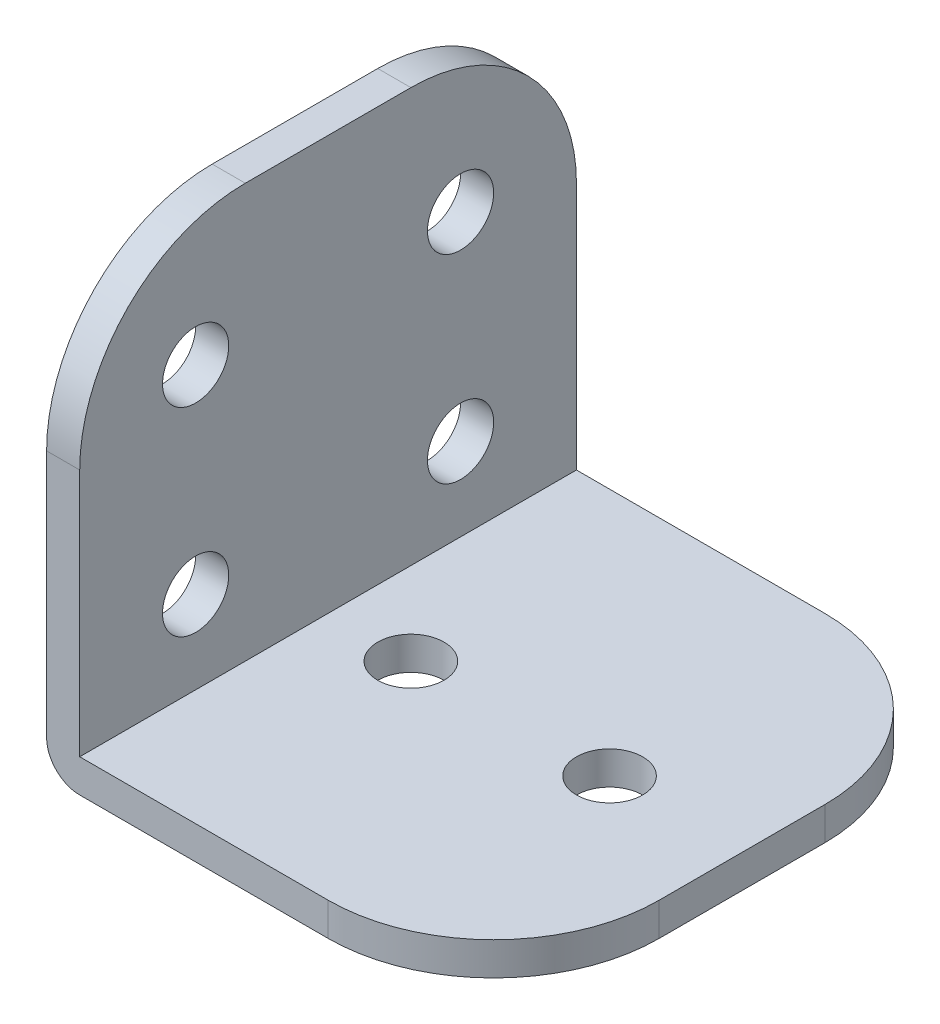
ISO-10303-21;
HEADER;
FILE_DESCRIPTION(('STEP AP214'),'2;1');
FILE_NAME('part.step','',(''),(''),'','','');
FILE_SCHEMA(('AUTOMOTIVE_DESIGN { 1 0 10303 214 1 1 1 1 }'));
ENDSEC;
DATA;
#1=APPLICATION_CONTEXT('core data for automotive mechanical design processes');
#2=APPLICATION_PROTOCOL_DEFINITION('international standard','automotive_design',2000,#1);
#3=PRODUCT_CONTEXT('',#1,'mechanical');
#4=PRODUCT('Part','Part','',(#3));
#5=PRODUCT_RELATED_PRODUCT_CATEGORY('part','',(#4));
#6=PRODUCT_DEFINITION_FORMATION('','',#4);
#7=PRODUCT_DEFINITION_CONTEXT('part definition',#1,'design');
#8=PRODUCT_DEFINITION('design','',#6,#7);
#9=PRODUCT_DEFINITION_SHAPE('','',#8);
#10=(LENGTH_UNIT() NAMED_UNIT(*) SI_UNIT(.MILLI.,.METRE.));
#11=(NAMED_UNIT(*) PLANE_ANGLE_UNIT() SI_UNIT($,.RADIAN.));
#12=(NAMED_UNIT(*) SI_UNIT($,.STERADIAN.) SOLID_ANGLE_UNIT());
#13=UNCERTAINTY_MEASURE_WITH_UNIT(LENGTH_MEASURE(1.E-05),#10,'distance_accuracy_value','');
#14=(GEOMETRIC_REPRESENTATION_CONTEXT(3) GLOBAL_UNCERTAINTY_ASSIGNED_CONTEXT((#13)) GLOBAL_UNIT_ASSIGNED_CONTEXT((#10,
#11,#12)) REPRESENTATION_CONTEXT('',''));
#15=CARTESIAN_POINT('',(0.,0.,0.));
#16=DIRECTION('',(0.,0.,1.));
#17=DIRECTION('',(1.,0.,0.));
#18=AXIS2_PLACEMENT_3D('',#15,#16,#17);
#19=CARTESIAN_POINT('',(0.,27.,15.));
#20=DIRECTION('',(0.,-1.,0.));
#21=DIRECTION('',(0.,0.,-1.));
#22=AXIS2_PLACEMENT_3D('',#19,#20,#21);
#23=PLANE('',#22);
#24=DIRECTION('',(0.,0.,-1.));
#25=VECTOR('',#24,1.);
#26=CARTESIAN_POINT('',(2.,27.,15.));
#27=LINE('',#26,#25);
#28=CARTESIAN_POINT('',(2.,27.,5.));
#29=VERTEX_POINT('',#28);
#30=CARTESIAN_POINT('',(2.,27.,-5.));
#31=VERTEX_POINT('',#30);
#32=EDGE_CURVE('E153',#29,#31,#27,.T.);
#33=ORIENTED_EDGE('',*,*,#32,.T.);
#34=DIRECTION('',(-1.,0.,0.));
#35=VECTOR('',#34,1.);
#36=CARTESIAN_POINT('',(0.,27.,-5.));
#37=LINE('',#36,#35);
#38=CARTESIAN_POINT('',(0.,27.,-5.));
#39=VERTEX_POINT('',#38);
#40=EDGE_CURVE('E198',#31,#39,#37,.T.);
#41=ORIENTED_EDGE('',*,*,#40,.T.);
#42=DIRECTION('',(0.,0.,-1.));
#43=VECTOR('',#42,1.);
#44=CARTESIAN_POINT('',(0.,27.,15.));
#45=LINE('',#44,#43);
#46=CARTESIAN_POINT('',(0.,27.,5.));
#47=VERTEX_POINT('',#46);
#48=EDGE_CURVE('E138',#47,#39,#45,.T.);
#49=ORIENTED_EDGE('',*,*,#48,.F.);
#50=DIRECTION('',(-1.,0.,0.));
#51=VECTOR('',#50,1.);
#52=CARTESIAN_POINT('',(2.,27.,5.));
#53=LINE('',#52,#51);
#54=EDGE_CURVE('E54',#47,#29,#53,.F.);
#55=ORIENTED_EDGE('',*,*,#54,.T.);
#56=EDGE_LOOP('',(#33,#41,#49,#55));
#57=FACE_BOUND('',#56,.T.);
#58=ADVANCED_FACE('F34',(#57),#23,.F.);
#59=CARTESIAN_POINT('',(0.,2.,15.));
#60=DIRECTION('',(1.,0.,0.));
#61=DIRECTION('',(0.,0.,-1.));
#62=AXIS2_PLACEMENT_3D('',#59,#60,#61);
#63=PLANE('',#62);
#64=CARTESIAN_POINT('',(0.,7.,8.));
#65=DIRECTION('',(1.,0.,0.));
#66=DIRECTION('',(0.,0.,-1.));
#67=AXIS2_PLACEMENT_3D('',#64,#65,#66);
#68=CIRCLE('',#67,2.);
#69=CARTESIAN_POINT('',(0.,7.,6.));
#70=VERTEX_POINT('',#69);
#71=EDGE_CURVE('E305',#70,#70,#68,.T.);
#72=ORIENTED_EDGE('',*,*,#71,.T.);
#73=EDGE_LOOP('',(#72));
#74=FACE_BOUND('',#73,.T.);
#75=CARTESIAN_POINT('',(0.,7.,-8.));
#76=DIRECTION('',(1.,0.,0.));
#77=DIRECTION('',(0.,0.,-1.));
#78=AXIS2_PLACEMENT_3D('',#75,#76,#77);
#79=CIRCLE('',#78,2.);
#80=CARTESIAN_POINT('',(0.,7.,-10.));
#81=VERTEX_POINT('',#80);
#82=EDGE_CURVE('E301',#81,#81,#79,.T.);
#83=ORIENTED_EDGE('',*,*,#82,.T.);
#84=EDGE_LOOP('',(#83));
#85=FACE_BOUND('',#84,.T.);
#86=CARTESIAN_POINT('',(0.,19.,-8.));
#87=DIRECTION('',(1.,0.,0.));
#88=DIRECTION('',(0.,0.,-1.));
#89=AXIS2_PLACEMENT_3D('',#86,#87,#88);
#90=CIRCLE('',#89,2.);
#91=CARTESIAN_POINT('',(0.,19.,-10.));
#92=VERTEX_POINT('',#91);
#93=EDGE_CURVE('E299',#92,#92,#90,.T.);
#94=ORIENTED_EDGE('',*,*,#93,.T.);
#95=EDGE_LOOP('',(#94));
#96=FACE_BOUND('',#95,.T.);
#97=CARTESIAN_POINT('',(0.,19.,8.));
#98=DIRECTION('',(1.,0.,0.));
#99=DIRECTION('',(0.,0.,-1.));
#100=AXIS2_PLACEMENT_3D('',#97,#98,#99);
#101=CIRCLE('',#100,2.);
#102=CARTESIAN_POINT('',(0.,19.,6.));
#103=VERTEX_POINT('',#102);
#104=EDGE_CURVE('E302',#103,#103,#101,.T.);
#105=ORIENTED_EDGE('',*,*,#104,.T.);
#106=EDGE_LOOP('',(#105));
#107=FACE_BOUND('',#106,.T.);
#108=ORIENTED_EDGE('',*,*,#48,.T.);
#109=CARTESIAN_POINT('',(0.,17.,-5.));
#110=DIRECTION('',(1.,0.,0.));
#111=DIRECTION('',(0.,0.,-1.));
#112=AXIS2_PLACEMENT_3D('',#109,#110,#111);
#113=CIRCLE('',#112,10.);
#114=CARTESIAN_POINT('',(0.,17.,-15.));
#115=VERTEX_POINT('',#114);
#116=EDGE_CURVE('E203',#39,#115,#113,.F.);
#117=ORIENTED_EDGE('',*,*,#116,.T.);
#118=DIRECTION('',(0.,-1.,0.));
#119=VECTOR('',#118,1.);
#120=CARTESIAN_POINT('',(0.,2.,-15.));
#121=LINE('',#120,#119);
#122=CARTESIAN_POINT('',(0.,2.,-15.));
#123=VERTEX_POINT('',#122);
#124=EDGE_CURVE('E135',#115,#123,#121,.T.);
#125=ORIENTED_EDGE('',*,*,#124,.T.);
#126=DIRECTION('',(0.,0.,-1.));
#127=VECTOR('',#126,1.);
#128=CARTESIAN_POINT('',(0.,2.,15.));
#129=LINE('',#128,#127);
#130=CARTESIAN_POINT('',(0.,2.,15.));
#131=VERTEX_POINT('',#130);
#132=EDGE_CURVE('E131',#131,#123,#129,.T.);
#133=ORIENTED_EDGE('',*,*,#132,.F.);
#134=DIRECTION('',(0.,-1.,0.));
#135=VECTOR('',#134,1.);
#136=CARTESIAN_POINT('',(0.,2.,15.));
#137=LINE('',#136,#135);
#138=CARTESIAN_POINT('',(0.,17.,15.));
#139=VERTEX_POINT('',#138);
#140=EDGE_CURVE('E117',#139,#131,#137,.T.);
#141=ORIENTED_EDGE('',*,*,#140,.F.);
#142=CARTESIAN_POINT('',(0.,17.,5.));
#143=DIRECTION('',(1.,0.,0.));
#144=DIRECTION('',(0.,0.,-1.));
#145=AXIS2_PLACEMENT_3D('',#142,#143,#144);
#146=CIRCLE('',#145,10.);
#147=EDGE_CURVE('E201',#139,#47,#146,.F.);
#148=ORIENTED_EDGE('',*,*,#147,.T.);
#149=EDGE_LOOP('',(#108,#117,#125,#133,#141,#148));
#150=FACE_BOUND('',#149,.T.);
#151=ADVANCED_FACE('F133',(#74,#85,#96,#107,#150),#63,.F.);
#152=CARTESIAN_POINT('',(2.,2.,15.));
#153=DIRECTION('',(0.,0.,-1.));
#154=DIRECTION('',(-1.,0.,0.));
#155=AXIS2_PLACEMENT_3D('',#152,#153,#154);
#156=CYLINDRICAL_SURFACE('',#155,2.);
#157=CARTESIAN_POINT('',(2.,2.,-15.));
#158=DIRECTION('',(0.,0.,1.));
#159=DIRECTION('',(1.,0.,0.));
#160=AXIS2_PLACEMENT_3D('',#157,#158,#159);
#161=CIRCLE('',#160,2.);
#162=CARTESIAN_POINT('',(2.,0.,-15.));
#163=VERTEX_POINT('',#162);
#164=EDGE_CURVE('E155',#123,#163,#161,.T.);
#165=ORIENTED_EDGE('',*,*,#164,.T.);
#166=DIRECTION('',(0.,0.,-1.));
#167=VECTOR('',#166,1.);
#168=CARTESIAN_POINT('',(2.,0.,15.));
#169=LINE('',#168,#167);
#170=CARTESIAN_POINT('',(2.,0.,15.));
#171=VERTEX_POINT('',#170);
#172=EDGE_CURVE('E139',#171,#163,#169,.T.);
#173=ORIENTED_EDGE('',*,*,#172,.F.);
#174=CARTESIAN_POINT('',(2.,2.,15.));
#175=DIRECTION('',(0.,0.,1.));
#176=DIRECTION('',(1.,0.,0.));
#177=AXIS2_PLACEMENT_3D('',#174,#175,#176);
#178=CIRCLE('',#177,2.);
#179=EDGE_CURVE('E122',#131,#171,#178,.T.);
#180=ORIENTED_EDGE('',*,*,#179,.F.);
#181=ORIENTED_EDGE('',*,*,#132,.T.);
#182=EDGE_LOOP('',(#165,#173,#180,#181));
#183=FACE_BOUND('',#182,.T.);
#184=ADVANCED_FACE('F141',(#183),#156,.T.);
#185=CARTESIAN_POINT('',(2.,0.,15.));
#186=DIRECTION('',(0.,1.,0.));
#187=DIRECTION('',(0.,0.,1.));
#188=AXIS2_PLACEMENT_3D('',#185,#186,#187);
#189=PLANE('',#188);
#190=CARTESIAN_POINT('',(7.,0.,0.));
#191=DIRECTION('',(0.,1.,0.));
#192=DIRECTION('',(0.,0.,1.));
#193=AXIS2_PLACEMENT_3D('',#190,#191,#192);
#194=CIRCLE('',#193,2.);
#195=CARTESIAN_POINT('',(7.,0.,2.));
#196=VERTEX_POINT('',#195);
#197=EDGE_CURVE('E156',#196,#196,#194,.T.);
#198=ORIENTED_EDGE('',*,*,#197,.T.);
#199=EDGE_LOOP('',(#198));
#200=FACE_BOUND('',#199,.T.);
#201=CARTESIAN_POINT('',(19.,0.,0.));
#202=DIRECTION('',(0.,1.,0.));
#203=DIRECTION('',(0.,0.,1.));
#204=AXIS2_PLACEMENT_3D('',#201,#202,#203);
#205=CIRCLE('',#204,2.);
#206=CARTESIAN_POINT('',(19.,0.,2.));
#207=VERTEX_POINT('',#206);
#208=EDGE_CURVE('E318',#207,#207,#205,.T.);
#209=ORIENTED_EDGE('',*,*,#208,.T.);
#210=EDGE_LOOP('',(#209));
#211=FACE_BOUND('',#210,.T.);
#212=DIRECTION('',(1.,0.,0.));
#213=VECTOR('',#212,1.);
#214=CARTESIAN_POINT('',(2.,0.,-15.));
#215=LINE('',#214,#213);
#216=CARTESIAN_POINT('',(17.,0.,-15.));
#217=VERTEX_POINT('',#216);
#218=EDGE_CURVE('E158',#163,#217,#215,.T.);
#219=ORIENTED_EDGE('',*,*,#218,.T.);
#220=CARTESIAN_POINT('',(17.,0.,-5.));
#221=DIRECTION('',(0.,1.,0.));
#222=DIRECTION('',(0.,0.,1.));
#223=AXIS2_PLACEMENT_3D('',#220,#221,#222);
#224=CIRCLE('',#223,10.);
#225=CARTESIAN_POINT('',(27.,0.,-5.));
#226=VERTEX_POINT('',#225);
#227=EDGE_CURVE('E191',#217,#226,#224,.F.);
#228=ORIENTED_EDGE('',*,*,#227,.T.);
#229=DIRECTION('',(0.,0.,-1.));
#230=VECTOR('',#229,1.);
#231=CARTESIAN_POINT('',(27.,0.,15.));
#232=LINE('',#231,#230);
#233=CARTESIAN_POINT('',(27.,0.,5.));
#234=VERTEX_POINT('',#233);
#235=EDGE_CURVE('E171',#234,#226,#232,.T.);
#236=ORIENTED_EDGE('',*,*,#235,.F.);
#237=CARTESIAN_POINT('',(17.,0.,5.));
#238=DIRECTION('',(0.,1.,0.));
#239=DIRECTION('',(0.,0.,1.));
#240=AXIS2_PLACEMENT_3D('',#237,#238,#239);
#241=CIRCLE('',#240,10.);
#242=CARTESIAN_POINT('',(17.,0.,15.));
#243=VERTEX_POINT('',#242);
#244=EDGE_CURVE('E189',#234,#243,#241,.F.);
#245=ORIENTED_EDGE('',*,*,#244,.T.);
#246=DIRECTION('',(1.,0.,0.));
#247=VECTOR('',#246,1.);
#248=CARTESIAN_POINT('',(2.,0.,15.));
#249=LINE('',#248,#247);
#250=EDGE_CURVE('E144',#171,#243,#249,.T.);
#251=ORIENTED_EDGE('',*,*,#250,.F.);
#252=ORIENTED_EDGE('',*,*,#172,.T.);
#253=EDGE_LOOP('',(#219,#228,#236,#245,#251,#252));
#254=FACE_BOUND('',#253,.T.);
#255=ADVANCED_FACE('F220',(#200,#211,#254),#189,.F.);
#256=CARTESIAN_POINT('',(27.,2.,15.));
#257=DIRECTION('',(-1.,0.,0.));
#258=DIRECTION('',(0.,0.,1.));
#259=AXIS2_PLACEMENT_3D('',#256,#257,#258);
#260=PLANE('',#259);
#261=ORIENTED_EDGE('',*,*,#235,.T.);
#262=DIRECTION('',(0.,1.,0.));
#263=VECTOR('',#262,1.);
#264=CARTESIAN_POINT('',(27.,2.,-5.));
#265=LINE('',#264,#263);
#266=CARTESIAN_POINT('',(27.,2.,-5.));
#267=VERTEX_POINT('',#266);
#268=EDGE_CURVE('E178',#226,#267,#265,.T.);
#269=ORIENTED_EDGE('',*,*,#268,.T.);
#270=DIRECTION('',(0.,0.,-1.));
#271=VECTOR('',#270,1.);
#272=CARTESIAN_POINT('',(27.,2.,15.));
#273=LINE('',#272,#271);
#274=CARTESIAN_POINT('',(27.,2.,5.));
#275=VERTEX_POINT('',#274);
#276=EDGE_CURVE('E168',#275,#267,#273,.T.);
#277=ORIENTED_EDGE('',*,*,#276,.F.);
#278=DIRECTION('',(0.,1.,0.));
#279=VECTOR('',#278,1.);
#280=CARTESIAN_POINT('',(27.,0.,5.));
#281=LINE('',#280,#279);
#282=EDGE_CURVE('E176',#275,#234,#281,.F.);
#283=ORIENTED_EDGE('',*,*,#282,.T.);
#284=EDGE_LOOP('',(#261,#269,#277,#283));
#285=FACE_BOUND('',#284,.T.);
#286=ADVANCED_FACE('F232',(#285),#260,.F.);
#287=CARTESIAN_POINT('',(2.,2.,15.));
#288=DIRECTION('',(0.,-1.,0.));
#289=DIRECTION('',(0.,0.,-1.));
#290=AXIS2_PLACEMENT_3D('',#287,#288,#289);
#291=PLANE('',#290);
#292=CARTESIAN_POINT('',(7.,2.,0.));
#293=DIRECTION('',(0.,1.,0.));
#294=DIRECTION('',(0.,0.,1.));
#295=AXIS2_PLACEMENT_3D('',#292,#293,#294);
#296=CIRCLE('',#295,2.);
#297=CARTESIAN_POINT('',(7.,2.,2.));
#298=VERTEX_POINT('',#297);
#299=EDGE_CURVE('E315',#298,#298,#296,.T.);
#300=ORIENTED_EDGE('',*,*,#299,.F.);
#301=EDGE_LOOP('',(#300));
#302=FACE_BOUND('',#301,.T.);
#303=CARTESIAN_POINT('',(19.,2.,0.));
#304=DIRECTION('',(0.,1.,0.));
#305=DIRECTION('',(0.,0.,1.));
#306=AXIS2_PLACEMENT_3D('',#303,#304,#305);
#307=CIRCLE('',#306,2.);
#308=CARTESIAN_POINT('',(19.,2.,2.));
#309=VERTEX_POINT('',#308);
#310=EDGE_CURVE('E314',#309,#309,#307,.T.);
#311=ORIENTED_EDGE('',*,*,#310,.F.);
#312=EDGE_LOOP('',(#311));
#313=FACE_BOUND('',#312,.T.);
#314=ORIENTED_EDGE('',*,*,#276,.T.);
#315=CARTESIAN_POINT('',(17.,2.,-5.));
#316=DIRECTION('',(0.,-1.,0.));
#317=DIRECTION('',(0.,0.,-1.));
#318=AXIS2_PLACEMENT_3D('',#315,#316,#317);
#319=CIRCLE('',#318,10.);
#320=CARTESIAN_POINT('',(17.,2.,-15.));
#321=VERTEX_POINT('',#320);
#322=EDGE_CURVE('E183',#267,#321,#319,.F.);
#323=ORIENTED_EDGE('',*,*,#322,.T.);
#324=DIRECTION('',(-1.,0.,0.));
#325=VECTOR('',#324,1.);
#326=CARTESIAN_POINT('',(2.,2.,-15.));
#327=LINE('',#326,#325);
#328=CARTESIAN_POINT('',(2.,2.,-15.));
#329=VERTEX_POINT('',#328);
#330=EDGE_CURVE('E161',#321,#329,#327,.T.);
#331=ORIENTED_EDGE('',*,*,#330,.T.);
#332=DIRECTION('',(0.,0.,-1.));
#333=VECTOR('',#332,1.);
#334=CARTESIAN_POINT('',(2.,2.,15.));
#335=LINE('',#334,#333);
#336=CARTESIAN_POINT('',(2.,2.,15.));
#337=VERTEX_POINT('',#336);
#338=EDGE_CURVE('E165',#337,#329,#335,.T.);
#339=ORIENTED_EDGE('',*,*,#338,.F.);
#340=DIRECTION('',(-1.,0.,0.));
#341=VECTOR('',#340,1.);
#342=CARTESIAN_POINT('',(2.,2.,15.));
#343=LINE('',#342,#341);
#344=CARTESIAN_POINT('',(17.,2.,15.));
#345=VERTEX_POINT('',#344);
#346=EDGE_CURVE('E146',#345,#337,#343,.T.);
#347=ORIENTED_EDGE('',*,*,#346,.F.);
#348=CARTESIAN_POINT('',(17.,2.,5.));
#349=DIRECTION('',(0.,-1.,0.));
#350=DIRECTION('',(0.,0.,-1.));
#351=AXIS2_PLACEMENT_3D('',#348,#349,#350);
#352=CIRCLE('',#351,10.);
#353=EDGE_CURVE('E181',#345,#275,#352,.F.);
#354=ORIENTED_EDGE('',*,*,#353,.T.);
#355=EDGE_LOOP('',(#314,#323,#331,#339,#347,#354));
#356=FACE_BOUND('',#355,.T.);
#357=ADVANCED_FACE('F230',(#302,#313,#356),#291,.F.);
#358=CARTESIAN_POINT('',(2.,2.,15.));
#359=DIRECTION('',(-1.,0.,0.));
#360=DIRECTION('',(0.,0.,1.));
#361=AXIS2_PLACEMENT_3D('',#358,#359,#360);
#362=PLANE('',#361);
#363=CARTESIAN_POINT('',(2.,7.,8.));
#364=DIRECTION('',(1.,0.,0.));
#365=DIRECTION('',(0.,0.,-1.));
#366=AXIS2_PLACEMENT_3D('',#363,#364,#365);
#367=CIRCLE('',#366,2.);
#368=CARTESIAN_POINT('',(2.,7.,6.));
#369=VERTEX_POINT('',#368);
#370=EDGE_CURVE('E341',#369,#369,#367,.T.);
#371=ORIENTED_EDGE('',*,*,#370,.F.);
#372=EDGE_LOOP('',(#371));
#373=FACE_BOUND('',#372,.T.);
#374=CARTESIAN_POINT('',(2.,7.,-8.));
#375=DIRECTION('',(1.,0.,0.));
#376=DIRECTION('',(0.,0.,-1.));
#377=AXIS2_PLACEMENT_3D('',#374,#375,#376);
#378=CIRCLE('',#377,2.);
#379=CARTESIAN_POINT('',(2.,7.,-10.));
#380=VERTEX_POINT('',#379);
#381=EDGE_CURVE('E344',#380,#380,#378,.T.);
#382=ORIENTED_EDGE('',*,*,#381,.F.);
#383=EDGE_LOOP('',(#382));
#384=FACE_BOUND('',#383,.T.);
#385=CARTESIAN_POINT('',(2.,19.,-8.));
#386=DIRECTION('',(1.,0.,0.));
#387=DIRECTION('',(0.,0.,-1.));
#388=AXIS2_PLACEMENT_3D('',#385,#386,#387);
#389=CIRCLE('',#388,2.);
#390=CARTESIAN_POINT('',(2.,19.,-10.));
#391=VERTEX_POINT('',#390);
#392=EDGE_CURVE('E296',#391,#391,#389,.T.);
#393=ORIENTED_EDGE('',*,*,#392,.F.);
#394=EDGE_LOOP('',(#393));
#395=FACE_BOUND('',#394,.T.);
#396=CARTESIAN_POINT('',(2.,19.,8.));
#397=DIRECTION('',(1.,0.,0.));
#398=DIRECTION('',(0.,0.,-1.));
#399=AXIS2_PLACEMENT_3D('',#396,#397,#398);
#400=CIRCLE('',#399,2.);
#401=CARTESIAN_POINT('',(2.,19.,6.));
#402=VERTEX_POINT('',#401);
#403=EDGE_CURVE('E308',#402,#402,#400,.T.);
#404=ORIENTED_EDGE('',*,*,#403,.F.);
#405=EDGE_LOOP('',(#404));
#406=FACE_BOUND('',#405,.T.);
#407=DIRECTION('',(0.,1.,0.));
#408=VECTOR('',#407,1.);
#409=CARTESIAN_POINT('',(2.,2.,-15.));
#410=LINE('',#409,#408);
#411=CARTESIAN_POINT('',(2.,17.,-15.));
#412=VERTEX_POINT('',#411);
#413=EDGE_CURVE('E128',#329,#412,#410,.T.);
#414=ORIENTED_EDGE('',*,*,#413,.T.);
#415=CARTESIAN_POINT('',(2.,17.,-5.));
#416=DIRECTION('',(-1.,0.,0.));
#417=DIRECTION('',(0.,0.,1.));
#418=AXIS2_PLACEMENT_3D('',#415,#416,#417);
#419=CIRCLE('',#418,10.);
#420=EDGE_CURVE('E11',#412,#31,#419,.F.);
#421=ORIENTED_EDGE('',*,*,#420,.T.);
#422=ORIENTED_EDGE('',*,*,#32,.F.);
#423=CARTESIAN_POINT('',(2.,17.,5.));
#424=DIRECTION('',(-1.,0.,0.));
#425=DIRECTION('',(0.,0.,1.));
#426=AXIS2_PLACEMENT_3D('',#423,#424,#425);
#427=CIRCLE('',#426,10.);
#428=CARTESIAN_POINT('',(2.,17.,15.));
#429=VERTEX_POINT('',#428);
#430=EDGE_CURVE('E42',#29,#429,#427,.F.);
#431=ORIENTED_EDGE('',*,*,#430,.T.);
#432=DIRECTION('',(0.,1.,0.));
#433=VECTOR('',#432,1.);
#434=CARTESIAN_POINT('',(2.,2.,15.));
#435=LINE('',#434,#433);
#436=EDGE_CURVE('E151',#337,#429,#435,.T.);
#437=ORIENTED_EDGE('',*,*,#436,.F.);
#438=ORIENTED_EDGE('',*,*,#338,.T.);
#439=EDGE_LOOP('',(#414,#421,#422,#431,#437,#438));
#440=FACE_BOUND('',#439,.T.);
#441=ADVANCED_FACE('F206',(#373,#384,#395,#406,#440),#362,.F.);
#442=CARTESIAN_POINT('',(2.,2.,15.));
#443=DIRECTION('',(0.,0.,1.));
#444=DIRECTION('',(1.,0.,0.));
#445=AXIS2_PLACEMENT_3D('',#442,#443,#444);
#446=PLANE('',#445);
#447=ORIENTED_EDGE('',*,*,#250,.T.);
#448=DIRECTION('',(0.,1.,0.));
#449=VECTOR('',#448,1.);
#450=CARTESIAN_POINT('',(17.,2.,15.));
#451=LINE('',#450,#449);
#452=EDGE_CURVE('E194',#243,#345,#451,.T.);
#453=ORIENTED_EDGE('',*,*,#452,.T.);
#454=ORIENTED_EDGE('',*,*,#346,.T.);
#455=ORIENTED_EDGE('',*,*,#436,.T.);
#456=DIRECTION('',(-1.,0.,0.));
#457=VECTOR('',#456,1.);
#458=CARTESIAN_POINT('',(0.,17.,15.));
#459=LINE('',#458,#457);
#460=EDGE_CURVE('E126',#429,#139,#459,.T.);
#461=ORIENTED_EDGE('',*,*,#460,.T.);
#462=ORIENTED_EDGE('',*,*,#140,.T.);
#463=ORIENTED_EDGE('',*,*,#179,.T.);
#464=EDGE_LOOP('',(#447,#453,#454,#455,#461,#462,#463));
#465=FACE_BOUND('',#464,.T.);
#466=ADVANCED_FACE('F120',(#465),#446,.T.);
#467=CARTESIAN_POINT('',(2.,2.,-15.));
#468=DIRECTION('',(0.,0.,1.));
#469=DIRECTION('',(1.,0.,0.));
#470=AXIS2_PLACEMENT_3D('',#467,#468,#469);
#471=PLANE('',#470);
#472=ORIENTED_EDGE('',*,*,#330,.F.);
#473=DIRECTION('',(0.,1.,0.));
#474=VECTOR('',#473,1.);
#475=CARTESIAN_POINT('',(17.,2.,-15.));
#476=LINE('',#475,#474);
#477=EDGE_CURVE('E187',#321,#217,#476,.F.);
#478=ORIENTED_EDGE('',*,*,#477,.T.);
#479=ORIENTED_EDGE('',*,*,#218,.F.);
#480=ORIENTED_EDGE('',*,*,#164,.F.);
#481=ORIENTED_EDGE('',*,*,#124,.F.);
#482=DIRECTION('',(-1.,0.,0.));
#483=VECTOR('',#482,1.);
#484=CARTESIAN_POINT('',(2.,17.,-15.));
#485=LINE('',#484,#483);
#486=EDGE_CURVE('E185',#115,#412,#485,.F.);
#487=ORIENTED_EDGE('',*,*,#486,.T.);
#488=ORIENTED_EDGE('',*,*,#413,.F.);
#489=EDGE_LOOP('',(#472,#478,#479,#480,#481,#487,#488));
#490=FACE_BOUND('',#489,.T.);
#491=ADVANCED_FACE('F216',(#490),#471,.F.);
#492=CARTESIAN_POINT('',(17.,2.,-5.));
#493=DIRECTION('',(0.,1.,0.));
#494=DIRECTION('',(0.,0.,1.));
#495=AXIS2_PLACEMENT_3D('',#492,#493,#494);
#496=CYLINDRICAL_SURFACE('',#495,10.);
#497=ORIENTED_EDGE('',*,*,#227,.F.);
#498=ORIENTED_EDGE('',*,*,#477,.F.);
#499=ORIENTED_EDGE('',*,*,#322,.F.);
#500=ORIENTED_EDGE('',*,*,#268,.F.);
#501=EDGE_LOOP('',(#497,#498,#499,#500));
#502=FACE_BOUND('',#501,.T.);
#503=ADVANCED_FACE('F235',(#502),#496,.T.);
#504=CARTESIAN_POINT('',(17.,2.,5.));
#505=DIRECTION('',(0.,-1.,0.));
#506=DIRECTION('',(0.,0.,-1.));
#507=AXIS2_PLACEMENT_3D('',#504,#505,#506);
#508=CYLINDRICAL_SURFACE('',#507,10.);
#509=ORIENTED_EDGE('',*,*,#244,.F.);
#510=ORIENTED_EDGE('',*,*,#282,.F.);
#511=ORIENTED_EDGE('',*,*,#353,.F.);
#512=ORIENTED_EDGE('',*,*,#452,.F.);
#513=EDGE_LOOP('',(#509,#510,#511,#512));
#514=FACE_BOUND('',#513,.T.);
#515=ADVANCED_FACE('F226',(#514),#508,.T.);
#516=CARTESIAN_POINT('',(0.,17.,-5.));
#517=DIRECTION('',(-1.,0.,0.));
#518=DIRECTION('',(0.,0.,1.));
#519=AXIS2_PLACEMENT_3D('',#516,#517,#518);
#520=CYLINDRICAL_SURFACE('',#519,10.);
#521=ORIENTED_EDGE('',*,*,#420,.F.);
#522=ORIENTED_EDGE('',*,*,#486,.F.);
#523=ORIENTED_EDGE('',*,*,#116,.F.);
#524=ORIENTED_EDGE('',*,*,#40,.F.);
#525=EDGE_LOOP('',(#521,#522,#523,#524));
#526=FACE_BOUND('',#525,.T.);
#527=ADVANCED_FACE('F212',(#526),#520,.T.);
#528=CARTESIAN_POINT('',(2.,17.,5.));
#529=DIRECTION('',(1.,0.,0.));
#530=DIRECTION('',(0.,0.,-1.));
#531=AXIS2_PLACEMENT_3D('',#528,#529,#530);
#532=CYLINDRICAL_SURFACE('',#531,10.);
#533=ORIENTED_EDGE('',*,*,#430,.F.);
#534=ORIENTED_EDGE('',*,*,#54,.F.);
#535=ORIENTED_EDGE('',*,*,#147,.F.);
#536=ORIENTED_EDGE('',*,*,#460,.F.);
#537=EDGE_LOOP('',(#533,#534,#535,#536));
#538=FACE_BOUND('',#537,.T.);
#539=ADVANCED_FACE('F36',(#538),#532,.T.);
#540=CARTESIAN_POINT('',(19.,-8.,0.));
#541=DIRECTION('',(0.,1.,0.));
#542=DIRECTION('',(0.,0.,1.));
#543=AXIS2_PLACEMENT_3D('',#540,#541,#542);
#544=CYLINDRICAL_SURFACE('',#543,2.);
#545=ORIENTED_EDGE('',*,*,#310,.T.);
#546=EDGE_LOOP('',(#545));
#547=FACE_BOUND('',#546,.T.);
#548=ORIENTED_EDGE('',*,*,#208,.F.);
#549=EDGE_LOOP('',(#548));
#550=FACE_BOUND('',#549,.T.);
#551=ADVANCED_FACE('F268',(#547,#550),#544,.F.);
#552=CARTESIAN_POINT('',(7.,-8.,0.));
#553=DIRECTION('',(0.,1.,0.));
#554=DIRECTION('',(0.,0.,1.));
#555=AXIS2_PLACEMENT_3D('',#552,#553,#554);
#556=CYLINDRICAL_SURFACE('',#555,2.);
#557=ORIENTED_EDGE('',*,*,#299,.T.);
#558=EDGE_LOOP('',(#557));
#559=FACE_BOUND('',#558,.T.);
#560=ORIENTED_EDGE('',*,*,#197,.F.);
#561=EDGE_LOOP('',(#560));
#562=FACE_BOUND('',#561,.T.);
#563=ADVANCED_FACE('F271',(#559,#562),#556,.F.);
#564=CARTESIAN_POINT('',(-8.,19.,8.));
#565=DIRECTION('',(1.,0.,0.));
#566=DIRECTION('',(0.,0.,-1.));
#567=AXIS2_PLACEMENT_3D('',#564,#565,#566);
#568=CYLINDRICAL_SURFACE('',#567,2.);
#569=ORIENTED_EDGE('',*,*,#403,.T.);
#570=EDGE_LOOP('',(#569));
#571=FACE_BOUND('',#570,.T.);
#572=ORIENTED_EDGE('',*,*,#104,.F.);
#573=EDGE_LOOP('',(#572));
#574=FACE_BOUND('',#573,.T.);
#575=ADVANCED_FACE('F275',(#571,#574),#568,.F.);
#576=CARTESIAN_POINT('',(-8.,19.,-8.));
#577=DIRECTION('',(1.,0.,0.));
#578=DIRECTION('',(0.,0.,-1.));
#579=AXIS2_PLACEMENT_3D('',#576,#577,#578);
#580=CYLINDRICAL_SURFACE('',#579,2.);
#581=ORIENTED_EDGE('',*,*,#392,.T.);
#582=EDGE_LOOP('',(#581));
#583=FACE_BOUND('',#582,.T.);
#584=ORIENTED_EDGE('',*,*,#93,.F.);
#585=EDGE_LOOP('',(#584));
#586=FACE_BOUND('',#585,.T.);
#587=ADVANCED_FACE('F279',(#583,#586),#580,.F.);
#588=CARTESIAN_POINT('',(-8.,7.,-8.));
#589=DIRECTION('',(1.,0.,0.));
#590=DIRECTION('',(0.,0.,-1.));
#591=AXIS2_PLACEMENT_3D('',#588,#589,#590);
#592=CYLINDRICAL_SURFACE('',#591,2.);
#593=ORIENTED_EDGE('',*,*,#381,.T.);
#594=EDGE_LOOP('',(#593));
#595=FACE_BOUND('',#594,.T.);
#596=ORIENTED_EDGE('',*,*,#82,.F.);
#597=EDGE_LOOP('',(#596));
#598=FACE_BOUND('',#597,.T.);
#599=ADVANCED_FACE('F284',(#595,#598),#592,.F.);
#600=CARTESIAN_POINT('',(-8.,7.,8.));
#601=DIRECTION('',(1.,0.,0.));
#602=DIRECTION('',(0.,0.,-1.));
#603=AXIS2_PLACEMENT_3D('',#600,#601,#602);
#604=CYLINDRICAL_SURFACE('',#603,2.);
#605=ORIENTED_EDGE('',*,*,#370,.T.);
#606=EDGE_LOOP('',(#605));
#607=FACE_BOUND('',#606,.T.);
#608=ORIENTED_EDGE('',*,*,#71,.F.);
#609=EDGE_LOOP('',(#608));
#610=FACE_BOUND('',#609,.T.);
#611=ADVANCED_FACE('F281',(#607,#610),#604,.F.);
#612=CLOSED_SHELL('',(#58,#151,#184,#255,#286,#357,#441,#466,#491,#503,#515,#527,#539,#551,#563,
#575,#587,#599,#611));
#613=MANIFOLD_SOLID_BREP('B2',#612);
#614=ADVANCED_BREP_SHAPE_REPRESENTATION('',(#18,#613),#14);
#615=SHAPE_DEFINITION_REPRESENTATION(#9,#614);
ENDSEC;
END-ISO-10303-21;
